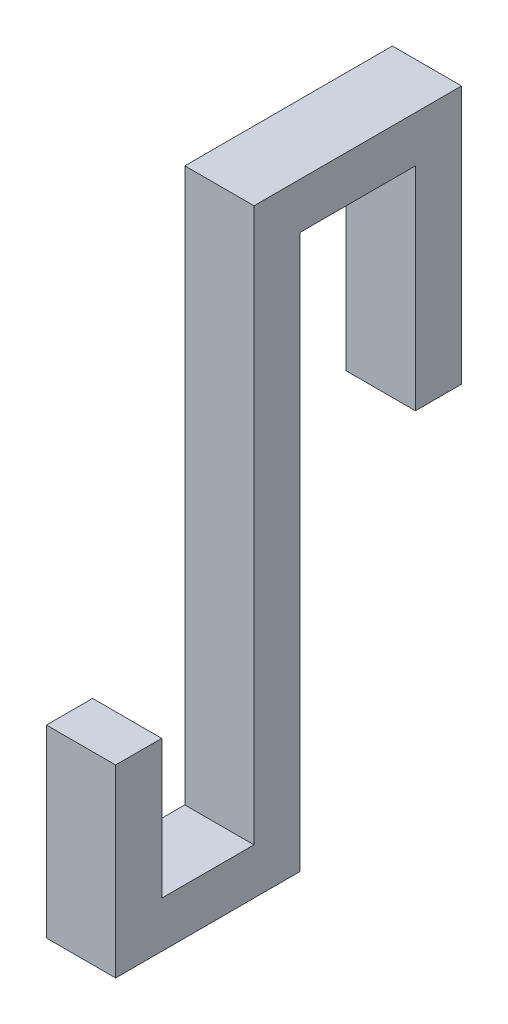
ISO-10303-21;
HEADER;
FILE_DESCRIPTION(('STEP AP214'),'2;1');
FILE_NAME('part.step','',(''),(''),'','','');
FILE_SCHEMA(('AUTOMOTIVE_DESIGN { 1 0 10303 214 1 1 1 1 }'));
ENDSEC;
DATA;
#1=APPLICATION_CONTEXT('core data for automotive mechanical design processes');
#2=APPLICATION_PROTOCOL_DEFINITION('international standard','automotive_design',2000,#1);
#3=PRODUCT_CONTEXT('',#1,'mechanical');
#4=PRODUCT('Part','Part','',(#3));
#5=PRODUCT_RELATED_PRODUCT_CATEGORY('part','',(#4));
#6=PRODUCT_DEFINITION_FORMATION('','',#4);
#7=PRODUCT_DEFINITION_CONTEXT('part definition',#1,'design');
#8=PRODUCT_DEFINITION('design','',#6,#7);
#9=PRODUCT_DEFINITION_SHAPE('','',#8);
#10=(LENGTH_UNIT() NAMED_UNIT(*) SI_UNIT(.MILLI.,.METRE.));
#11=(NAMED_UNIT(*) PLANE_ANGLE_UNIT() SI_UNIT($,.RADIAN.));
#12=(NAMED_UNIT(*) SI_UNIT($,.STERADIAN.) SOLID_ANGLE_UNIT());
#13=UNCERTAINTY_MEASURE_WITH_UNIT(LENGTH_MEASURE(1.E-05),#10,'distance_accuracy_value','');
#14=(GEOMETRIC_REPRESENTATION_CONTEXT(3) GLOBAL_UNCERTAINTY_ASSIGNED_CONTEXT((#13)) GLOBAL_UNIT_ASSIGNED_CONTEXT((#10,
#11,#12)) REPRESENTATION_CONTEXT('',''));
#15=CARTESIAN_POINT('',(0.,0.,0.));
#16=DIRECTION('',(0.,0.,1.));
#17=DIRECTION('',(1.,0.,0.));
#18=AXIS2_PLACEMENT_3D('',#15,#16,#17);
#19=CARTESIAN_POINT('',(15.,0.,-30.8240956037035));
#20=DIRECTION('',(0.,0.,-1.));
#21=DIRECTION('',(0.,1.,0.));
#22=AXIS2_PLACEMENT_3D('',#19,#20,#21);
#23=PLANE('',#22);
#24=DIRECTION('',(0.,-1.,0.));
#25=VECTOR('',#24,1.);
#26=CARTESIAN_POINT('',(0.,0.,-30.8240956037035));
#27=LINE('',#26,#25);
#28=CARTESIAN_POINT('',(0.,67.0609251465692,-30.8240956037035));
#29=VERTEX_POINT('',#28);
#30=CARTESIAN_POINT('',(0.,21.0609251465692,-30.8240956037035));
#31=VERTEX_POINT('',#30);
#32=EDGE_CURVE('E155',#29,#31,#27,.T.);
#33=ORIENTED_EDGE('',*,*,#32,.T.);
#34=DIRECTION('',(-1.,0.,0.));
#35=VECTOR('',#34,1.);
#36=CARTESIAN_POINT('',(15.,21.0609251465692,-30.8240956037035));
#37=LINE('',#36,#35);
#38=CARTESIAN_POINT('',(15.,21.0609251465692,-30.8240956037035));
#39=VERTEX_POINT('',#38);
#40=EDGE_CURVE('E11',#39,#31,#37,.T.);
#41=ORIENTED_EDGE('',*,*,#40,.F.);
#42=DIRECTION('',(0.,-1.,0.));
#43=VECTOR('',#42,1.);
#44=CARTESIAN_POINT('',(15.,0.,-30.8240956037035));
#45=LINE('',#44,#43);
#46=CARTESIAN_POINT('',(15.,67.0609251465692,-30.8240956037035));
#47=VERTEX_POINT('',#46);
#48=EDGE_CURVE('E182',#47,#39,#45,.T.);
#49=ORIENTED_EDGE('',*,*,#48,.F.);
#50=DIRECTION('',(-1.,0.,0.));
#51=VECTOR('',#50,1.);
#52=CARTESIAN_POINT('',(15.,67.0609251465692,-30.8240956037035));
#53=LINE('',#52,#51);
#54=EDGE_CURVE('E151',#47,#29,#53,.T.);
#55=ORIENTED_EDGE('',*,*,#54,.T.);
#56=EDGE_LOOP('',(#33,#41,#49,#55));
#57=FACE_BOUND('',#56,.T.);
#58=ADVANCED_FACE('F35',(#57),#23,.F.);
#59=CARTESIAN_POINT('',(15.,21.0609251465692,0.));
#60=DIRECTION('',(0.,1.,0.));
#61=DIRECTION('',(0.,0.,1.));
#62=AXIS2_PLACEMENT_3D('',#59,#60,#61);
#63=PLANE('',#62);
#64=DIRECTION('',(0.,0.,-1.));
#65=VECTOR('',#64,1.);
#66=CARTESIAN_POINT('',(0.,21.0609251465692,0.));
#67=LINE('',#66,#65);
#68=CARTESIAN_POINT('',(0.,21.0609251465692,-40.8240956037035));
#69=VERTEX_POINT('',#68);
#70=EDGE_CURVE('E158',#31,#69,#67,.T.);
#71=ORIENTED_EDGE('',*,*,#70,.T.);
#72=DIRECTION('',(-1.,0.,0.));
#73=VECTOR('',#72,1.);
#74=CARTESIAN_POINT('',(15.,21.0609251465692,-40.8240956037035));
#75=LINE('',#74,#73);
#76=CARTESIAN_POINT('',(15.,21.0609251465692,-40.8240956037035));
#77=VERTEX_POINT('',#76);
#78=EDGE_CURVE('E43',#77,#69,#75,.T.);
#79=ORIENTED_EDGE('',*,*,#78,.F.);
#80=DIRECTION('',(0.,0.,-1.));
#81=VECTOR('',#80,1.);
#82=CARTESIAN_POINT('',(15.,21.0609251465692,0.));
#83=LINE('',#82,#81);
#84=EDGE_CURVE('E106',#39,#77,#83,.T.);
#85=ORIENTED_EDGE('',*,*,#84,.F.);
#86=ORIENTED_EDGE('',*,*,#40,.T.);
#87=EDGE_LOOP('',(#71,#79,#85,#86));
#88=FACE_BOUND('',#87,.T.);
#89=ADVANCED_FACE('F252',(#88),#63,.F.);
#90=CARTESIAN_POINT('',(15.,0.,-40.8240956037035));
#91=DIRECTION('',(0.,0.,1.));
#92=DIRECTION('',(0.,-1.,0.));
#93=AXIS2_PLACEMENT_3D('',#90,#91,#92);
#94=PLANE('',#93);
#95=DIRECTION('',(0.,1.,0.));
#96=VECTOR('',#95,1.);
#97=CARTESIAN_POINT('',(0.,0.,-40.8240956037035));
#98=LINE('',#97,#96);
#99=CARTESIAN_POINT('',(0.,77.0609251465692,-40.8240956037035));
#100=VERTEX_POINT('',#99);
#101=EDGE_CURVE('E160',#69,#100,#98,.T.);
#102=ORIENTED_EDGE('',*,*,#101,.T.);
#103=DIRECTION('',(-1.,0.,0.));
#104=VECTOR('',#103,1.);
#105=CARTESIAN_POINT('',(15.,77.0609251465692,-40.8240956037035));
#106=LINE('',#105,#104);
#107=CARTESIAN_POINT('',(15.,77.0609251465692,-40.8240956037035));
#108=VERTEX_POINT('',#107);
#109=EDGE_CURVE('E197',#108,#100,#106,.T.);
#110=ORIENTED_EDGE('',*,*,#109,.F.);
#111=DIRECTION('',(0.,1.,0.));
#112=VECTOR('',#111,1.);
#113=CARTESIAN_POINT('',(15.,0.,-40.8240956037035));
#114=LINE('',#113,#112);
#115=EDGE_CURVE('E205',#77,#108,#114,.T.);
#116=ORIENTED_EDGE('',*,*,#115,.F.);
#117=ORIENTED_EDGE('',*,*,#78,.T.);
#118=EDGE_LOOP('',(#102,#110,#116,#117));
#119=FACE_BOUND('',#118,.T.);
#120=ADVANCED_FACE('F203',(#119),#94,.F.);
#121=CARTESIAN_POINT('',(15.,77.0609251465692,0.));
#122=DIRECTION('',(0.,-1.,0.));
#123=DIRECTION('',(0.,0.,-1.));
#124=AXIS2_PLACEMENT_3D('',#121,#122,#123);
#125=PLANE('',#124);
#126=DIRECTION('',(0.,0.,1.));
#127=VECTOR('',#126,1.);
#128=CARTESIAN_POINT('',(0.,77.0609251465692,0.));
#129=LINE('',#128,#127);
#130=CARTESIAN_POINT('',(0.,77.0609251465692,4.17590439629656));
#131=VERTEX_POINT('',#130);
#132=EDGE_CURVE('E162',#100,#131,#129,.T.);
#133=ORIENTED_EDGE('',*,*,#132,.T.);
#134=DIRECTION('',(-1.,0.,0.));
#135=VECTOR('',#134,1.);
#136=CARTESIAN_POINT('',(15.,77.0609251465692,4.17590439629656));
#137=LINE('',#136,#135);
#138=CARTESIAN_POINT('',(15.,77.0609251465692,4.17590439629656));
#139=VERTEX_POINT('',#138);
#140=EDGE_CURVE('E194',#139,#131,#137,.T.);
#141=ORIENTED_EDGE('',*,*,#140,.F.);
#142=DIRECTION('',(0.,0.,1.));
#143=VECTOR('',#142,1.);
#144=CARTESIAN_POINT('',(15.,77.0609251465692,0.));
#145=LINE('',#144,#143);
#146=EDGE_CURVE('E223',#108,#139,#145,.T.);
#147=ORIENTED_EDGE('',*,*,#146,.F.);
#148=ORIENTED_EDGE('',*,*,#109,.T.);
#149=EDGE_LOOP('',(#133,#141,#147,#148));
#150=FACE_BOUND('',#149,.T.);
#151=ADVANCED_FACE('F213',(#150),#125,.F.);
#152=CARTESIAN_POINT('',(15.,0.,4.17590439629655));
#153=DIRECTION('',(0.,0.,-1.));
#154=DIRECTION('',(0.,1.,0.));
#155=AXIS2_PLACEMENT_3D('',#152,#153,#154);
#156=PLANE('',#155);
#157=DIRECTION('',(0.,-1.,0.));
#158=VECTOR('',#157,1.);
#159=CARTESIAN_POINT('',(0.,0.,4.17590439629655));
#160=LINE('',#159,#158);
#161=CARTESIAN_POINT('',(0.,-42.9390748534308,4.17590439629654));
#162=VERTEX_POINT('',#161);
#163=EDGE_CURVE('E164',#131,#162,#160,.T.);
#164=ORIENTED_EDGE('',*,*,#163,.T.);
#165=DIRECTION('',(-1.,0.,0.));
#166=VECTOR('',#165,1.);
#167=CARTESIAN_POINT('',(15.,-42.9390748534308,4.17590439629654));
#168=LINE('',#167,#166);
#169=CARTESIAN_POINT('',(15.,-42.9390748534308,4.17590439629654));
#170=VERTEX_POINT('',#169);
#171=EDGE_CURVE('E192',#170,#162,#168,.T.);
#172=ORIENTED_EDGE('',*,*,#171,.F.);
#173=DIRECTION('',(0.,-1.,0.));
#174=VECTOR('',#173,1.);
#175=CARTESIAN_POINT('',(15.,0.,4.17590439629655));
#176=LINE('',#175,#174);
#177=EDGE_CURVE('E219',#139,#170,#176,.T.);
#178=ORIENTED_EDGE('',*,*,#177,.F.);
#179=ORIENTED_EDGE('',*,*,#140,.T.);
#180=EDGE_LOOP('',(#164,#172,#178,#179));
#181=FACE_BOUND('',#180,.T.);
#182=ADVANCED_FACE('F217',(#181),#156,.F.);
#183=CARTESIAN_POINT('',(15.,-42.9390748534308,0.));
#184=DIRECTION('',(0.,1.,0.));
#185=DIRECTION('',(0.,0.,1.));
#186=AXIS2_PLACEMENT_3D('',#183,#184,#185);
#187=PLANE('',#186);
#188=DIRECTION('',(0.,0.,-1.));
#189=VECTOR('',#188,1.);
#190=CARTESIAN_POINT('',(0.,-42.9390748534308,0.));
#191=LINE('',#190,#189);
#192=CARTESIAN_POINT('',(0.,-42.9390748534308,24.1759043962965));
#193=VERTEX_POINT('',#192);
#194=EDGE_CURVE('E167',#193,#162,#191,.T.);
#195=ORIENTED_EDGE('',*,*,#194,.F.);
#196=DIRECTION('',(-1.,0.,0.));
#197=VECTOR('',#196,1.);
#198=CARTESIAN_POINT('',(15.,-42.9390748534308,24.1759043962965));
#199=LINE('',#198,#197);
#200=CARTESIAN_POINT('',(15.,-42.9390748534308,24.1759043962965));
#201=VERTEX_POINT('',#200);
#202=EDGE_CURVE('E190',#201,#193,#199,.T.);
#203=ORIENTED_EDGE('',*,*,#202,.F.);
#204=DIRECTION('',(0.,0.,-1.));
#205=VECTOR('',#204,1.);
#206=CARTESIAN_POINT('',(15.,-42.9390748534308,0.));
#207=LINE('',#206,#205);
#208=EDGE_CURVE('E222',#201,#170,#207,.T.);
#209=ORIENTED_EDGE('',*,*,#208,.T.);
#210=ORIENTED_EDGE('',*,*,#171,.T.);
#211=EDGE_LOOP('',(#195,#203,#209,#210));
#212=FACE_BOUND('',#211,.T.);
#213=ADVANCED_FACE('F265',(#212),#187,.T.);
#214=CARTESIAN_POINT('',(15.,0.,24.1759043962965));
#215=DIRECTION('',(0.,0.,-1.));
#216=DIRECTION('',(0.,1.,0.));
#217=AXIS2_PLACEMENT_3D('',#214,#215,#216);
#218=PLANE('',#217);
#219=DIRECTION('',(0.,-1.,0.));
#220=VECTOR('',#219,1.);
#221=CARTESIAN_POINT('',(0.,0.,24.1759043962965));
#222=LINE('',#221,#220);
#223=CARTESIAN_POINT('',(0.,-12.9390748534308,24.1759043962965));
#224=VERTEX_POINT('',#223);
#225=EDGE_CURVE('E170',#224,#193,#222,.T.);
#226=ORIENTED_EDGE('',*,*,#225,.F.);
#227=DIRECTION('',(-1.,0.,0.));
#228=VECTOR('',#227,1.);
#229=CARTESIAN_POINT('',(15.,-12.9390748534308,24.1759043962965));
#230=LINE('',#229,#228);
#231=CARTESIAN_POINT('',(15.,-12.9390748534308,24.1759043962965));
#232=VERTEX_POINT('',#231);
#233=EDGE_CURVE('E188',#232,#224,#230,.T.);
#234=ORIENTED_EDGE('',*,*,#233,.F.);
#235=DIRECTION('',(0.,-1.,0.));
#236=VECTOR('',#235,1.);
#237=CARTESIAN_POINT('',(15.,0.,24.1759043962965));
#238=LINE('',#237,#236);
#239=EDGE_CURVE('E225',#232,#201,#238,.T.);
#240=ORIENTED_EDGE('',*,*,#239,.T.);
#241=ORIENTED_EDGE('',*,*,#202,.T.);
#242=EDGE_LOOP('',(#226,#234,#240,#241));
#243=FACE_BOUND('',#242,.T.);
#244=ADVANCED_FACE('F268',(#243),#218,.T.);
#245=CARTESIAN_POINT('',(15.,-12.9390748534308,0.));
#246=DIRECTION('',(0.,1.,0.));
#247=DIRECTION('',(0.,0.,1.));
#248=AXIS2_PLACEMENT_3D('',#245,#246,#247);
#249=PLANE('',#248);
#250=DIRECTION('',(0.,0.,-1.));
#251=VECTOR('',#250,1.);
#252=CARTESIAN_POINT('',(0.,-12.9390748534308,0.));
#253=LINE('',#252,#251);
#254=CARTESIAN_POINT('',(0.,-12.9390748534308,34.1759043962966));
#255=VERTEX_POINT('',#254);
#256=EDGE_CURVE('E173',#255,#224,#253,.T.);
#257=ORIENTED_EDGE('',*,*,#256,.F.);
#258=DIRECTION('',(-1.,0.,0.));
#259=VECTOR('',#258,1.);
#260=CARTESIAN_POINT('',(15.,-12.9390748534308,34.1759043962966));
#261=LINE('',#260,#259);
#262=CARTESIAN_POINT('',(15.,-12.9390748534308,34.1759043962966));
#263=VERTEX_POINT('',#262);
#264=EDGE_CURVE('E186',#263,#255,#261,.T.);
#265=ORIENTED_EDGE('',*,*,#264,.F.);
#266=DIRECTION('',(0.,0.,-1.));
#267=VECTOR('',#266,1.);
#268=CARTESIAN_POINT('',(15.,-12.9390748534308,0.));
#269=LINE('',#268,#267);
#270=EDGE_CURVE('E232',#263,#232,#269,.T.);
#271=ORIENTED_EDGE('',*,*,#270,.T.);
#272=ORIENTED_EDGE('',*,*,#233,.T.);
#273=EDGE_LOOP('',(#257,#265,#271,#272));
#274=FACE_BOUND('',#273,.T.);
#275=ADVANCED_FACE('F272',(#274),#249,.T.);
#276=CARTESIAN_POINT('',(15.,0.,34.1759043962966));
#277=DIRECTION('',(0.,0.,1.));
#278=DIRECTION('',(1.,0.,0.));
#279=AXIS2_PLACEMENT_3D('',#276,#277,#278);
#280=PLANE('',#279);
#281=DIRECTION('',(0.,1.,0.));
#282=VECTOR('',#281,1.);
#283=CARTESIAN_POINT('',(0.,0.,34.1759043962966));
#284=LINE('',#283,#282);
#285=CARTESIAN_POINT('',(0.,-52.9390748534308,34.1759043962966));
#286=VERTEX_POINT('',#285);
#287=EDGE_CURVE('E176',#286,#255,#284,.T.);
#288=ORIENTED_EDGE('',*,*,#287,.F.);
#289=DIRECTION('',(-1.,0.,0.));
#290=VECTOR('',#289,1.);
#291=CARTESIAN_POINT('',(15.,-52.9390748534308,34.1759043962966));
#292=LINE('',#291,#290);
#293=CARTESIAN_POINT('',(15.,-52.9390748534308,34.1759043962966));
#294=VERTEX_POINT('',#293);
#295=EDGE_CURVE('E146',#294,#286,#292,.T.);
#296=ORIENTED_EDGE('',*,*,#295,.F.);
#297=DIRECTION('',(0.,1.,0.));
#298=VECTOR('',#297,1.);
#299=CARTESIAN_POINT('',(15.,0.,34.1759043962966));
#300=LINE('',#299,#298);
#301=EDGE_CURVE('E139',#294,#263,#300,.T.);
#302=ORIENTED_EDGE('',*,*,#301,.T.);
#303=ORIENTED_EDGE('',*,*,#264,.T.);
#304=EDGE_LOOP('',(#288,#296,#302,#303));
#305=FACE_BOUND('',#304,.T.);
#306=ADVANCED_FACE('F236',(#305),#280,.T.);
#307=CARTESIAN_POINT('',(15.,-52.9390748534308,0.));
#308=DIRECTION('',(0.,1.,0.));
#309=DIRECTION('',(0.,0.,1.));
#310=AXIS2_PLACEMENT_3D('',#307,#308,#309);
#311=PLANE('',#310);
#312=DIRECTION('',(0.,0.,-1.));
#313=VECTOR('',#312,1.);
#314=CARTESIAN_POINT('',(0.,-52.9390748534308,0.));
#315=LINE('',#314,#313);
#316=CARTESIAN_POINT('',(0.,-52.9390748534308,-5.82409560370346));
#317=VERTEX_POINT('',#316);
#318=EDGE_CURVE('E145',#286,#317,#315,.T.);
#319=ORIENTED_EDGE('',*,*,#318,.T.);
#320=DIRECTION('',(-1.,0.,0.));
#321=VECTOR('',#320,1.);
#322=CARTESIAN_POINT('',(15.,-52.9390748534308,-5.82409560370346));
#323=LINE('',#322,#321);
#324=CARTESIAN_POINT('',(15.,-52.9390748534308,-5.82409560370346));
#325=VERTEX_POINT('',#324);
#326=EDGE_CURVE('E142',#325,#317,#323,.T.);
#327=ORIENTED_EDGE('',*,*,#326,.F.);
#328=DIRECTION('',(0.,0.,-1.));
#329=VECTOR('',#328,1.);
#330=CARTESIAN_POINT('',(15.,-52.9390748534308,0.));
#331=LINE('',#330,#329);
#332=EDGE_CURVE('E132',#294,#325,#331,.T.);
#333=ORIENTED_EDGE('',*,*,#332,.F.);
#334=ORIENTED_EDGE('',*,*,#295,.T.);
#335=EDGE_LOOP('',(#319,#327,#333,#334));
#336=FACE_BOUND('',#335,.T.);
#337=ADVANCED_FACE('F143',(#336),#311,.F.);
#338=CARTESIAN_POINT('',(15.,0.,-5.82409560370346));
#339=DIRECTION('',(0.,0.,1.));
#340=DIRECTION('',(0.,-1.,0.));
#341=AXIS2_PLACEMENT_3D('',#338,#339,#340);
#342=PLANE('',#341);
#343=DIRECTION('',(0.,1.,0.));
#344=VECTOR('',#343,1.);
#345=CARTESIAN_POINT('',(0.,0.,-5.82409560370346));
#346=LINE('',#345,#344);
#347=CARTESIAN_POINT('',(0.,67.0609251465692,-5.82409560370346));
#348=VERTEX_POINT('',#347);
#349=EDGE_CURVE('E92',#317,#348,#346,.T.);
#350=ORIENTED_EDGE('',*,*,#349,.T.);
#351=DIRECTION('',(-1.,0.,0.));
#352=VECTOR('',#351,1.);
#353=CARTESIAN_POINT('',(15.,67.0609251465692,-5.82409560370346));
#354=LINE('',#353,#352);
#355=CARTESIAN_POINT('',(15.,67.0609251465692,-5.82409560370346));
#356=VERTEX_POINT('',#355);
#357=EDGE_CURVE('E147',#356,#348,#354,.T.);
#358=ORIENTED_EDGE('',*,*,#357,.F.);
#359=DIRECTION('',(0.,1.,0.));
#360=VECTOR('',#359,1.);
#361=CARTESIAN_POINT('',(15.,0.,-5.82409560370346));
#362=LINE('',#361,#360);
#363=EDGE_CURVE('E136',#325,#356,#362,.T.);
#364=ORIENTED_EDGE('',*,*,#363,.F.);
#365=ORIENTED_EDGE('',*,*,#326,.T.);
#366=EDGE_LOOP('',(#350,#358,#364,#365));
#367=FACE_BOUND('',#366,.T.);
#368=ADVANCED_FACE('F149',(#367),#342,.F.);
#369=CARTESIAN_POINT('',(15.,67.0609251465692,0.));
#370=DIRECTION('',(0.,1.,0.));
#371=DIRECTION('',(0.,0.,1.));
#372=AXIS2_PLACEMENT_3D('',#369,#370,#371);
#373=PLANE('',#372);
#374=DIRECTION('',(0.,0.,-1.));
#375=VECTOR('',#374,1.);
#376=CARTESIAN_POINT('',(0.,67.0609251465692,0.));
#377=LINE('',#376,#375);
#378=EDGE_CURVE('E98',#348,#29,#377,.T.);
#379=ORIENTED_EDGE('',*,*,#378,.T.);
#380=ORIENTED_EDGE('',*,*,#54,.F.);
#381=DIRECTION('',(0.,0.,-1.));
#382=VECTOR('',#381,1.);
#383=CARTESIAN_POINT('',(15.,67.0609251465692,0.));
#384=LINE('',#383,#382);
#385=EDGE_CURVE('E51',#356,#47,#384,.T.);
#386=ORIENTED_EDGE('',*,*,#385,.F.);
#387=ORIENTED_EDGE('',*,*,#357,.T.);
#388=EDGE_LOOP('',(#379,#380,#386,#387));
#389=FACE_BOUND('',#388,.T.);
#390=ADVANCED_FACE('F241',(#389),#373,.F.);
#391=CARTESIAN_POINT('',(15.,0.,0.));
#392=DIRECTION('',(1.,0.,0.));
#393=DIRECTION('',(0.,0.,-1.));
#394=AXIS2_PLACEMENT_3D('',#391,#392,#393);
#395=PLANE('',#394);
#396=ORIENTED_EDGE('',*,*,#48,.T.);
#397=ORIENTED_EDGE('',*,*,#84,.T.);
#398=ORIENTED_EDGE('',*,*,#115,.T.);
#399=ORIENTED_EDGE('',*,*,#146,.T.);
#400=ORIENTED_EDGE('',*,*,#177,.T.);
#401=ORIENTED_EDGE('',*,*,#208,.F.);
#402=ORIENTED_EDGE('',*,*,#239,.F.);
#403=ORIENTED_EDGE('',*,*,#270,.F.);
#404=ORIENTED_EDGE('',*,*,#301,.F.);
#405=ORIENTED_EDGE('',*,*,#332,.T.);
#406=ORIENTED_EDGE('',*,*,#363,.T.);
#407=ORIENTED_EDGE('',*,*,#385,.T.);
#408=EDGE_LOOP('',(#396,#397,#398,#399,#400,#401,#402,#403,#404,#405,#406,#407));
#409=FACE_BOUND('',#408,.T.);
#410=ADVANCED_FACE('F134',(#409),#395,.T.);
#411=CARTESIAN_POINT('',(0.,0.,0.));
#412=DIRECTION('',(1.,0.,0.));
#413=DIRECTION('',(0.,0.,-1.));
#414=AXIS2_PLACEMENT_3D('',#411,#412,#413);
#415=PLANE('',#414);
#416=ORIENTED_EDGE('',*,*,#32,.F.);
#417=ORIENTED_EDGE('',*,*,#378,.F.);
#418=ORIENTED_EDGE('',*,*,#349,.F.);
#419=ORIENTED_EDGE('',*,*,#318,.F.);
#420=ORIENTED_EDGE('',*,*,#287,.T.);
#421=ORIENTED_EDGE('',*,*,#256,.T.);
#422=ORIENTED_EDGE('',*,*,#225,.T.);
#423=ORIENTED_EDGE('',*,*,#194,.T.);
#424=ORIENTED_EDGE('',*,*,#163,.F.);
#425=ORIENTED_EDGE('',*,*,#132,.F.);
#426=ORIENTED_EDGE('',*,*,#101,.F.);
#427=ORIENTED_EDGE('',*,*,#70,.F.);
#428=EDGE_LOOP('',(#416,#417,#418,#419,#420,#421,#422,#423,#424,#425,#426,#427));
#429=FACE_BOUND('',#428,.T.);
#430=ADVANCED_FACE('F209',(#429),#415,.F.);
#431=CLOSED_SHELL('',(#58,#89,#120,#151,#182,#213,#244,#275,#306,#337,#368,#390,#410,#430));
#432=MANIFOLD_SOLID_BREP('B2',#431);
#433=ADVANCED_BREP_SHAPE_REPRESENTATION('',(#18,#432),#14);
#434=SHAPE_DEFINITION_REPRESENTATION(#9,#433);
ENDSEC;
END-ISO-10303-21;
